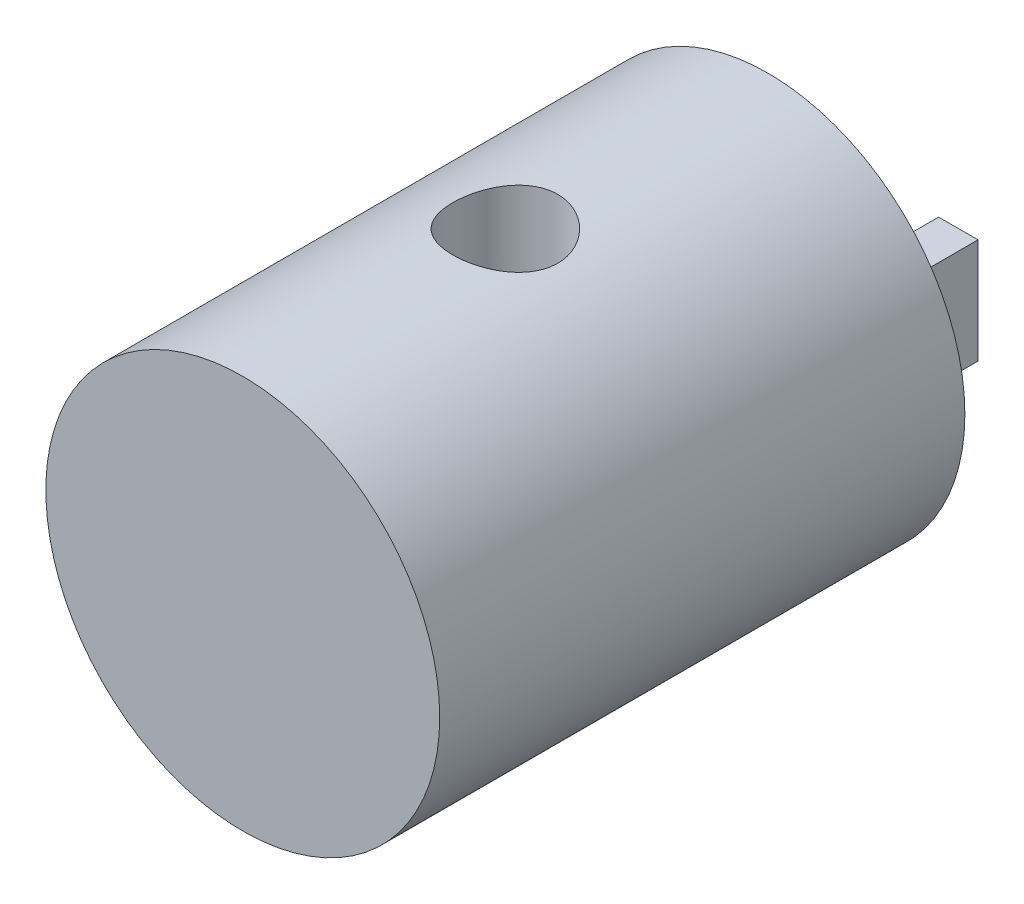
ISO-10303-21;
HEADER;
FILE_DESCRIPTION(('STEP AP214'),'2;1');
FILE_NAME('part.step','',(''),(''),'','','');
FILE_SCHEMA(('AUTOMOTIVE_DESIGN { 1 0 10303 214 1 1 1 1 }'));
ENDSEC;
DATA;
#1=APPLICATION_CONTEXT('core data for automotive mechanical design processes');
#2=APPLICATION_PROTOCOL_DEFINITION('international standard','automotive_design',2000,#1);
#3=PRODUCT_CONTEXT('',#1,'mechanical');
#4=PRODUCT('Part','Part','',(#3));
#5=PRODUCT_RELATED_PRODUCT_CATEGORY('part','',(#4));
#6=PRODUCT_DEFINITION_FORMATION('','',#4);
#7=PRODUCT_DEFINITION_CONTEXT('part definition',#1,'design');
#8=PRODUCT_DEFINITION('design','',#6,#7);
#9=PRODUCT_DEFINITION_SHAPE('','',#8);
#10=(LENGTH_UNIT() NAMED_UNIT(*) SI_UNIT(.MILLI.,.METRE.));
#11=(NAMED_UNIT(*) PLANE_ANGLE_UNIT() SI_UNIT($,.RADIAN.));
#12=(NAMED_UNIT(*) SI_UNIT($,.STERADIAN.) SOLID_ANGLE_UNIT());
#13=UNCERTAINTY_MEASURE_WITH_UNIT(LENGTH_MEASURE(1.E-05),#10,'distance_accuracy_value','');
#14=(GEOMETRIC_REPRESENTATION_CONTEXT(3) GLOBAL_UNCERTAINTY_ASSIGNED_CONTEXT((#13)) GLOBAL_UNIT_ASSIGNED_CONTEXT((#10,
#11,#12)) REPRESENTATION_CONTEXT('',''));
#15=CARTESIAN_POINT('',(0.,0.,0.));
#16=DIRECTION('',(0.,0.,1.));
#17=DIRECTION('',(1.,0.,0.));
#18=AXIS2_PLACEMENT_3D('',#15,#16,#17);
#19=CARTESIAN_POINT('',(0.,0.,20.));
#20=DIRECTION('',(0.,0.,-1.));
#21=DIRECTION('',(-1.,0.,0.));
#22=AXIS2_PLACEMENT_3D('',#19,#20,#21);
#23=CYLINDRICAL_SURFACE('',#22,7.5);
#24=CARTESIAN_POINT('',(0.,0.,20.));
#25=DIRECTION('',(0.,0.,1.));
#26=DIRECTION('',(1.,0.,0.));
#27=AXIS2_PLACEMENT_3D('',#24,#25,#26);
#28=CIRCLE('',#27,7.5);
#29=CARTESIAN_POINT('',(7.5,0.,20.));
#30=VERTEX_POINT('',#29);
#31=EDGE_CURVE('E11',#30,#30,#28,.T.);
#32=ORIENTED_EDGE('',*,*,#31,.F.);
#33=EDGE_LOOP('',(#32));
#34=FACE_BOUND('',#33,.T.);
#35=CARTESIAN_POINT('',(0.,0.,0.));
#36=DIRECTION('',(0.,0.,1.));
#37=DIRECTION('',(1.,0.,0.));
#38=AXIS2_PLACEMENT_3D('',#35,#36,#37);
#39=CIRCLE('',#38,7.5);
#40=CARTESIAN_POINT('',(7.5,0.,0.));
#41=VERTEX_POINT('',#40);
#42=EDGE_CURVE('E45',#41,#41,#39,.T.);
#43=ORIENTED_EDGE('',*,*,#42,.T.);
#44=EDGE_LOOP('',(#43));
#45=FACE_BOUND('',#44,.T.);
#46=CARTESIAN_POINT('',(0.,-7.5,12.));
#47=CARTESIAN_POINT('',(-0.110254555832854,-7.49999833810161,11.9999973830651));
#48=CARTESIAN_POINT('',(-0.220537160221841,-7.49754486162151,11.9908523858103));
#49=CARTESIAN_POINT('',(-0.437925451354464,-7.48799573621659,11.9545787692613));
#50=CARTESIAN_POINT('',(-0.545029583319086,-7.48089785332586,11.9274414955739));
#51=CARTESIAN_POINT('',(-0.752891589045313,-7.4628433325279,11.856128333136));
#52=CARTESIAN_POINT('',(-0.853657451015285,-7.45189167130375,11.811974412334));
#53=CARTESIAN_POINT('',(-1.04635368639266,-7.42728699151678,11.7079627573334));
#54=CARTESIAN_POINT('',(-1.13828347044963,-7.4136337929518,11.6481039766407));
#55=CARTESIAN_POINT('',(-1.31282950374002,-7.38474614901995,11.5129164835866));
#56=CARTESIAN_POINT('',(-1.39521168986279,-7.36948467678681,11.4372913319917));
#57=CARTESIAN_POINT('',(-1.54628713660638,-7.33927409679591,11.2733515169366));
#58=CARTESIAN_POINT('',(-1.61497863495664,-7.32432502947243,11.1850352223825));
#59=CARTESIAN_POINT('',(-1.73786409243415,-7.29615537464372,10.9963517651746));
#60=CARTESIAN_POINT('',(-1.79178877736487,-7.28296888563239,10.8958036717383));
#61=CARTESIAN_POINT('',(-1.88187548076994,-7.26021477318187,10.6866598889076));
#62=CARTESIAN_POINT('',(-1.91804077451369,-7.25064648253265,10.5780656876686));
#63=CARTESIAN_POINT('',(-1.97076920226504,-7.23649115802399,10.358504462175));
#64=CARTESIAN_POINT('',(-1.98775670244692,-7.2317964781149,10.2476464600693));
#65=CARTESIAN_POINT('',(-2.0029703470582,-7.2275983091637,10.0245623166935));
#66=CARTESIAN_POINT('',(-2.00119999705754,-7.22809385014446,9.91233643497593));
#67=CARTESIAN_POINT('',(-1.97928510002699,-7.2341237880203,9.69301458462594));
#68=CARTESIAN_POINT('',(-1.95965406064765,-7.23951735511531,9.58586281796151));
#69=CARTESIAN_POINT('',(-1.90339748722183,-7.25451013080688,9.37643166554376));
#70=CARTESIAN_POINT('',(-1.86677059492995,-7.26410967552612,9.27415266992465));
#71=CARTESIAN_POINT('',(-1.77714356965256,-7.28655661748386,9.07603185619142));
#72=CARTESIAN_POINT('',(-1.72396341137784,-7.29943942818703,8.98027566071374));
#73=CARTESIAN_POINT('',(-1.60286503823778,-7.32698229642445,8.79886584114848));
#74=CARTESIAN_POINT('',(-1.53494392224251,-7.34164270355186,8.71321421084353));
#75=CARTESIAN_POINT('',(-1.38366607263419,-7.37167510629863,8.5515110025452));
#76=CARTESIAN_POINT('',(-1.29987812728299,-7.38705471488831,8.47586368168505));
#77=CARTESIAN_POINT('',(-1.12061766820637,-7.41636381276316,8.33961121964971));
#78=CARTESIAN_POINT('',(-1.02514469420509,-7.43029324488555,8.27900667129757));
#79=CARTESIAN_POINT('',(-0.824598255497451,-7.45521820398293,8.17438209717535));
#80=CARTESIAN_POINT('',(-0.719484902551789,-7.4662007283356,8.13043522955141));
#81=CARTESIAN_POINT('',(-0.503002294390395,-7.48390044400999,8.06095281118663));
#82=CARTESIAN_POINT('',(-0.391634411928323,-7.49061856733749,8.03541323727604));
#83=CARTESIAN_POINT('',(-0.169254083145515,-7.49889158558384,8.00410512308217));
#84=CARTESIAN_POINT('',(-0.0583242376413798,-7.50058997470959,7.99778696014913));
#85=CARTESIAN_POINT('',(0.163010045901199,-7.49904471691695,8.00358316424694));
#86=CARTESIAN_POINT('',(0.273414537062114,-7.49580158080353,8.01569562610577));
#87=CARTESIAN_POINT('',(0.48860244990178,-7.48483035496021,8.05755844745998));
#88=CARTESIAN_POINT('',(0.593449852027782,-7.47718026546329,8.08700224619776));
#89=CARTESIAN_POINT('',(0.796706971176064,-7.45826294894139,8.16233594450795));
#90=CARTESIAN_POINT('',(0.895115989216027,-7.44699532996161,8.20822762625055));
#91=CARTESIAN_POINT('',(1.08483847466795,-7.42175660559528,8.31617388718054));
#92=CARTESIAN_POINT('',(1.17597518846118,-7.40773686604957,8.37852746679774));
#93=CARTESIAN_POINT('',(1.34668463539715,-7.37861452365563,8.51725163015799));
#94=CARTESIAN_POINT('',(1.42625507879918,-7.3635117072752,8.59362498260106));
#95=CARTESIAN_POINT('',(1.57388924478774,-7.33339745866704,8.76078557749456));
#96=CARTESIAN_POINT('',(1.64156519249816,-7.31840061429312,8.85191856139518));
#97=CARTESIAN_POINT('',(1.76067191185118,-7.29066447182727,9.04456469609963));
#98=CARTESIAN_POINT('',(1.81210336122161,-7.27792507956316,9.14607741362231));
#99=CARTESIAN_POINT('',(1.89687411586112,-7.2562926837321,9.35609530707611));
#100=CARTESIAN_POINT('',(1.93031812253958,-7.24737748318009,9.46455581181758));
#101=CARTESIAN_POINT('',(1.97841205118791,-7.234398251268,9.68583931967476));
#102=CARTESIAN_POINT('',(1.99306677602478,-7.23033298020014,9.79866120034792));
#103=CARTESIAN_POINT('',(2.00288989653714,-7.22761744573588,10.0214947878838));
#104=CARTESIAN_POINT('',(1.99868155618109,-7.22879397743239,10.1314773202583));
#105=CARTESIAN_POINT('',(1.97234376000439,-7.23602396081087,10.34910351401));
#106=CARTESIAN_POINT('',(1.95021476535025,-7.24207728699439,10.4567472355006));
#107=CARTESIAN_POINT('',(1.88902515699699,-7.25827571073158,10.6658557521298));
#108=CARTESIAN_POINT('',(1.8500966107558,-7.26838885019644,10.7673618427322));
#109=CARTESIAN_POINT('',(1.75651554562386,-7.29156818136177,10.9624788305341));
#110=CARTESIAN_POINT('',(1.70186056024616,-7.30463483621364,11.0560884863005));
#111=CARTESIAN_POINT('',(1.57648909268817,-7.3327292144046,11.2357303594966));
#112=CARTESIAN_POINT('',(1.50534729767909,-7.3478033310169,11.3214585349762));
#113=CARTESIAN_POINT('',(1.349830535111,-7.37795503783007,11.4799624516673));
#114=CARTESIAN_POINT('',(1.26545235435875,-7.39303262798441,11.5527350386688));
#115=CARTESIAN_POINT('',(1.08367998108868,-7.42187812403968,11.6847922376469));
#116=CARTESIAN_POINT('',(0.986045961751779,-7.43561111314551,11.7437550106493));
#117=CARTESIAN_POINT('',(0.781888640416889,-7.45983810102897,11.8443374159294));
#118=CARTESIAN_POINT('',(0.675371094696297,-7.47033417683594,11.8859681756636));
#119=CARTESIAN_POINT('',(0.47437470488099,-7.48554752513467,11.9452752854155));
#120=CARTESIAN_POINT('',(0.380762016565035,-7.49092770592602,11.9657493835925));
#121=CARTESIAN_POINT('',(0.191439795317076,-7.49815449036456,11.9931122061671));
#122=CARTESIAN_POINT('',(0.09573047040486,-7.5000014429727,12.0000022722));
#123=CARTESIAN_POINT('',(0.,-7.5,12.));
#124=B_SPLINE_CURVE_WITH_KNOTS('',3,(#46,#47,#48,#49,#50,#51,#52,#53,#54,#55,#56,#57,#58,#59,
#60,#61,#62,#63,#64,#65,#66,#67,#68,#69,#70,#71,#72,#73,#74,#75,#76,#77,#78,#79,#80,#81,#82,#83,
#84,#85,#86,#87,#88,#89,#90,#91,#92,#93,#94,#95,#96,#97,#98,#99,#100,#101,#102,#103,#104,#105,
#106,#107,#108,#109,#110,#111,#112,#113,#114,#115,#116,#117,#118,#119,#120,#121,#122,#123),
.UNSPECIFIED.,.T.,.F.,(4,2,2,2,2,2,2,2,2,2,2,2,2,2,2,2,2,2,2,2,2,2,2,2,2,2,2,2,2,2,2,2,2,2,2,2,
2,2,4),(0.,0.330412598949569,0.66098424376145,0.991130552971933,1.32129886708675,
1.65834897954967,1.99544244925149,2.33832582523229,2.68114594129699,3.01622158250468,
3.3512346040432,3.67691002045997,4.0026114681294,4.33198673346498,4.6614268811763,
5.00161259812322,5.34181171937597,5.68348809603041,6.02508977190139,6.35682717524547,
6.68853028925351,7.01453535642116,7.34057575775614,7.6730028600455,8.00549568258887,
8.34736496382789,8.68921998024107,9.02906297699387,9.36881908663983,9.69743342403611,
10.0260393052059,10.352107654483,10.67822717123,11.0139433957139,11.3497412433245,
11.692722522809,12.0354832614518,12.3223981899334,12.6092847796638),.UNSPECIFIED.);
#125=CARTESIAN_POINT('',(0.,-7.5,12.));
#126=VERTEX_POINT('',#125);
#127=EDGE_CURVE('E235',#126,#126,#124,.T.);
#128=ORIENTED_EDGE('',*,*,#127,.F.);
#129=EDGE_LOOP('',(#128));
#130=FACE_BOUND('',#129,.T.);
#131=CARTESIAN_POINT('',(0.,7.5,8.));
#132=CARTESIAN_POINT('',(0.110254555832854,7.49999833810161,8.00000261693485));
#133=CARTESIAN_POINT('',(0.22053716022184,7.49754486162151,8.00914761418967));
#134=CARTESIAN_POINT('',(0.437925451354463,7.48799573621659,8.0454212307387));
#135=CARTESIAN_POINT('',(0.545029583319086,7.48089785332586,8.07255850442612));
#136=CARTESIAN_POINT('',(0.752891589045312,7.4628433325279,8.14387166686403));
#137=CARTESIAN_POINT('',(0.853657451015285,7.45189167130375,8.18802558766602));
#138=CARTESIAN_POINT('',(1.04635368639266,7.42728699151678,8.29203724266662));
#139=CARTESIAN_POINT('',(1.13828347044963,7.4136337929518,8.35189602335929));
#140=CARTESIAN_POINT('',(1.31282950374002,7.38474614901995,8.48708351641337));
#141=CARTESIAN_POINT('',(1.39521168986279,7.36948467678681,8.56270866800827));
#142=CARTESIAN_POINT('',(1.54628713660638,7.33927409679591,8.72664848306336));
#143=CARTESIAN_POINT('',(1.61497863495664,7.32432502947243,8.81496477761753));
#144=CARTESIAN_POINT('',(1.73786409243415,7.29615537464372,9.00364823482545));
#145=CARTESIAN_POINT('',(1.79178877736487,7.28296888563239,9.10419632826173));
#146=CARTESIAN_POINT('',(1.88187548076994,7.26021477318187,9.31334011109242));
#147=CARTESIAN_POINT('',(1.91804077451369,7.25064648253265,9.42193431233144));
#148=CARTESIAN_POINT('',(1.97076920226504,7.23649115802399,9.64149553782501));
#149=CARTESIAN_POINT('',(1.98775670244692,7.2317964781149,9.75235353993074));
#150=CARTESIAN_POINT('',(2.0029703470582,7.2275983091637,9.97543768330654));
#151=CARTESIAN_POINT('',(2.00119999705754,7.22809385014446,10.0876635650241));
#152=CARTESIAN_POINT('',(1.97928510002699,7.2341237880203,10.3069854153741));
#153=CARTESIAN_POINT('',(1.95965406064765,7.23951735511531,10.4141371820385));
#154=CARTESIAN_POINT('',(1.90339748722183,7.25451013080688,10.6235683344562));
#155=CARTESIAN_POINT('',(1.86677059492995,7.26410967552612,10.7258473300753));
#156=CARTESIAN_POINT('',(1.77714356965256,7.28655661748386,10.9239681438086));
#157=CARTESIAN_POINT('',(1.72396341137784,7.29943942818703,11.0197243392863));
#158=CARTESIAN_POINT('',(1.60286503823778,7.32698229642445,11.2011341588515));
#159=CARTESIAN_POINT('',(1.53494392224251,7.34164270355186,11.2867857891565));
#160=CARTESIAN_POINT('',(1.38366607263419,7.37167510629863,11.4484889974548));
#161=CARTESIAN_POINT('',(1.29987812728299,7.38705471488831,11.524136318315));
#162=CARTESIAN_POINT('',(1.12061766820637,7.41636381276316,11.6603887803503));
#163=CARTESIAN_POINT('',(1.02514469420509,7.43029324488555,11.7209933287024));
#164=CARTESIAN_POINT('',(0.824598255497451,7.45521820398293,11.8256179028246));
#165=CARTESIAN_POINT('',(0.719484902551788,7.4662007283356,11.8695647704486));
#166=CARTESIAN_POINT('',(0.503002294390395,7.48390044400999,11.9390471888134));
#167=CARTESIAN_POINT('',(0.391634411928323,7.49061856733749,11.964586762724));
#168=CARTESIAN_POINT('',(0.169254083145515,7.49889158558384,11.9958948769178));
#169=CARTESIAN_POINT('',(0.0583242376413798,7.50058997470959,12.0022130398509));
#170=CARTESIAN_POINT('',(-0.163010045901199,7.49904471691695,11.9964168357531));
#171=CARTESIAN_POINT('',(-0.273414537062114,7.49580158080353,11.9843043738942));
#172=CARTESIAN_POINT('',(-0.488602449901779,7.48483035496021,11.94244155254));
#173=CARTESIAN_POINT('',(-0.593449852027782,7.47718026546329,11.9129977538022));
#174=CARTESIAN_POINT('',(-0.796706971176064,7.45826294894139,11.8376640554921));
#175=CARTESIAN_POINT('',(-0.895115989216027,7.44699532996161,11.7917723737495));
#176=CARTESIAN_POINT('',(-1.08483847466795,7.42175660559528,11.6838261128195));
#177=CARTESIAN_POINT('',(-1.17597518846118,7.40773686604957,11.6214725332023));
#178=CARTESIAN_POINT('',(-1.34668463539715,7.37861452365563,11.482748369842));
#179=CARTESIAN_POINT('',(-1.42625507879918,7.3635117072752,11.4063750173989));
#180=CARTESIAN_POINT('',(-1.57388924478774,7.33339745866704,11.2392144225054));
#181=CARTESIAN_POINT('',(-1.64156519249816,7.31840061429312,11.1480814386048));
#182=CARTESIAN_POINT('',(-1.76067191185118,7.29066447182727,10.9554353039004));
#183=CARTESIAN_POINT('',(-1.81210336122161,7.27792507956316,10.8539225863777));
#184=CARTESIAN_POINT('',(-1.89687411586112,7.2562926837321,10.6439046929239));
#185=CARTESIAN_POINT('',(-1.93031812253958,7.24737748318009,10.5354441881824));
#186=CARTESIAN_POINT('',(-1.97841205118791,7.234398251268,10.3141606803252));
#187=CARTESIAN_POINT('',(-1.99306677602478,7.23033298020014,10.2013387996521));
#188=CARTESIAN_POINT('',(-2.00288989653714,7.22761744573588,9.9785052121162));
#189=CARTESIAN_POINT('',(-1.99868155618109,7.22879397743239,9.86852267974172));
#190=CARTESIAN_POINT('',(-1.97234376000439,7.23602396081087,9.65089648598997));
#191=CARTESIAN_POINT('',(-1.95021476535025,7.24207728699439,9.54325276449942));
#192=CARTESIAN_POINT('',(-1.88902515699699,7.25827571073158,9.33414424787015));
#193=CARTESIAN_POINT('',(-1.8500966107558,7.26838885019644,9.23263815726781));
#194=CARTESIAN_POINT('',(-1.75651554562386,7.29156818136177,9.03752116946586));
#195=CARTESIAN_POINT('',(-1.70186056024616,7.30463483621364,8.9439115136995));
#196=CARTESIAN_POINT('',(-1.57648909268817,7.3327292144046,8.76426964050338));
#197=CARTESIAN_POINT('',(-1.50534729767909,7.3478033310169,8.67854146502378));
#198=CARTESIAN_POINT('',(-1.349830535111,7.37795503783007,8.52003754833267));
#199=CARTESIAN_POINT('',(-1.26545235435875,7.39303262798441,8.44726496133116));
#200=CARTESIAN_POINT('',(-1.08367998108868,7.42187812403968,8.31520776235314));
#201=CARTESIAN_POINT('',(-0.986045961751779,7.43561111314551,8.25624498935067));
#202=CARTESIAN_POINT('',(-0.781888640416889,7.45983810102897,8.15566258407064));
#203=CARTESIAN_POINT('',(-0.675371094696297,7.47033417683594,8.1140318243364));
#204=CARTESIAN_POINT('',(-0.47437470488099,7.48554752513467,8.05472471458448));
#205=CARTESIAN_POINT('',(-0.380762016565035,7.49092770592602,8.0342506164075));
#206=CARTESIAN_POINT('',(-0.191439795317076,7.49815449036456,8.00688779383294));
#207=CARTESIAN_POINT('',(-0.0957304704048602,7.5000014429727,7.99999772779998));
#208=CARTESIAN_POINT('',(0.,7.5,8.));
#209=B_SPLINE_CURVE_WITH_KNOTS('',3,(#131,#132,#133,#134,#135,#136,#137,#138,#139,#140,#141,
#142,#143,#144,#145,#146,#147,#148,#149,#150,#151,#152,#153,#154,#155,#156,#157,#158,#159,#160,
#161,#162,#163,#164,#165,#166,#167,#168,#169,#170,#171,#172,#173,#174,#175,#176,#177,#178,#179,
#180,#181,#182,#183,#184,#185,#186,#187,#188,#189,#190,#191,#192,#193,#194,#195,#196,#197,#198,
#199,#200,#201,#202,#203,#204,#205,#206,#207,#208),.UNSPECIFIED.,.T.,.F.,(4,2,2,2,2,2,2,2,2,2,2,
2,2,2,2,2,2,2,2,2,2,2,2,2,2,2,2,2,2,2,2,2,2,2,2,2,2,2,4),(0.,0.330412598949569,0.66098424376145,
0.991130552971931,1.32129886708675,1.65834897954967,1.99544244925149,2.33832582523229,
2.68114594129699,3.01622158250468,3.3512346040432,3.67691002045997,4.0026114681294,
4.33198673346498,4.6614268811763,5.00161259812322,5.34181171937597,5.68348809603041,
6.02508977190139,6.35682717524547,6.68853028925351,7.01453535642116,7.34057575775614,
7.6730028600455,8.00549568258887,8.34736496382788,8.68921998024107,9.02906297699387,
9.36881908663983,9.69743342403611,10.0260393052059,10.352107654483,10.67822717123,
11.0139433957139,11.3497412433245,11.692722522809,12.0354832614518,12.3223981899334,
12.6092847796638),.UNSPECIFIED.);
#210=CARTESIAN_POINT('',(0.,7.5,8.));
#211=VERTEX_POINT('',#210);
#212=EDGE_CURVE('E227',#211,#211,#209,.T.);
#213=ORIENTED_EDGE('',*,*,#212,.T.);
#214=EDGE_LOOP('',(#213));
#215=FACE_BOUND('',#214,.T.);
#216=ADVANCED_FACE('F37',(#34,#45,#130,#215),#23,.T.);
#217=CARTESIAN_POINT('',(-4.,2.,-4.));
#218=DIRECTION('',(0.,-1.,0.));
#219=DIRECTION('',(0.,0.,-1.));
#220=AXIS2_PLACEMENT_3D('',#217,#218,#219);
#221=PLANE('',#220);
#222=DIRECTION('',(1.,0.,0.));
#223=VECTOR('',#222,1.);
#224=CARTESIAN_POINT('',(-4.,2.,-4.));
#225=LINE('',#224,#223);
#226=CARTESIAN_POINT('',(2.5,2.,-4.));
#227=VERTEX_POINT('',#226);
#228=CARTESIAN_POINT('',(4.,2.,-4.));
#229=VERTEX_POINT('',#228);
#230=EDGE_CURVE('E124',#227,#229,#225,.T.);
#231=ORIENTED_EDGE('',*,*,#230,.F.);
#232=DIRECTION('',(0.,0.,-1.));
#233=VECTOR('',#232,1.);
#234=CARTESIAN_POINT('',(2.5,2.,0.));
#235=LINE('',#234,#233);
#236=CARTESIAN_POINT('',(2.5,2.,0.));
#237=VERTEX_POINT('',#236);
#238=EDGE_CURVE('E110',#237,#227,#235,.T.);
#239=ORIENTED_EDGE('',*,*,#238,.F.);
#240=DIRECTION('',(1.,0.,0.));
#241=VECTOR('',#240,1.);
#242=CARTESIAN_POINT('',(-4.,2.,0.));
#243=LINE('',#242,#241);
#244=CARTESIAN_POINT('',(4.,2.,0.));
#245=VERTEX_POINT('',#244);
#246=EDGE_CURVE('E138',#237,#245,#243,.T.);
#247=ORIENTED_EDGE('',*,*,#246,.T.);
#248=DIRECTION('',(0.,0.,1.));
#249=VECTOR('',#248,1.);
#250=CARTESIAN_POINT('',(4.,2.,-4.));
#251=LINE('',#250,#249);
#252=EDGE_CURVE('E153',#229,#245,#251,.T.);
#253=ORIENTED_EDGE('',*,*,#252,.F.);
#254=EDGE_LOOP('',(#231,#239,#247,#253));
#255=FACE_BOUND('',#254,.T.);
#256=ADVANCED_FACE('F177',(#255),#221,.F.);
#257=CARTESIAN_POINT('',(4.,-2.,-4.));
#258=DIRECTION('',(0.,1.,0.));
#259=DIRECTION('',(0.,0.,1.));
#260=AXIS2_PLACEMENT_3D('',#257,#258,#259);
#261=PLANE('',#260);
#262=DIRECTION('',(-1.,0.,0.));
#263=VECTOR('',#262,1.);
#264=CARTESIAN_POINT('',(4.,-2.,0.));
#265=LINE('',#264,#263);
#266=CARTESIAN_POINT('',(4.,-2.,0.));
#267=VERTEX_POINT('',#266);
#268=CARTESIAN_POINT('',(2.5,-2.,0.));
#269=VERTEX_POINT('',#268);
#270=EDGE_CURVE('E142',#267,#269,#265,.T.);
#271=ORIENTED_EDGE('',*,*,#270,.T.);
#272=DIRECTION('',(0.,0.,1.));
#273=VECTOR('',#272,1.);
#274=CARTESIAN_POINT('',(2.5,-2.,0.));
#275=LINE('',#274,#273);
#276=CARTESIAN_POINT('',(2.5,-2.,-4.));
#277=VERTEX_POINT('',#276);
#278=EDGE_CURVE('E117',#277,#269,#275,.T.);
#279=ORIENTED_EDGE('',*,*,#278,.F.);
#280=DIRECTION('',(-1.,0.,0.));
#281=VECTOR('',#280,1.);
#282=CARTESIAN_POINT('',(4.,-2.,-4.));
#283=LINE('',#282,#281);
#284=CARTESIAN_POINT('',(4.,-2.,-4.));
#285=VERTEX_POINT('',#284);
#286=EDGE_CURVE('E131',#285,#277,#283,.T.);
#287=ORIENTED_EDGE('',*,*,#286,.F.);
#288=DIRECTION('',(0.,0.,1.));
#289=VECTOR('',#288,1.);
#290=CARTESIAN_POINT('',(4.,-2.,-4.));
#291=LINE('',#290,#289);
#292=EDGE_CURVE('E150',#285,#267,#291,.T.);
#293=ORIENTED_EDGE('',*,*,#292,.T.);
#294=EDGE_LOOP('',(#271,#279,#287,#293));
#295=FACE_BOUND('',#294,.T.);
#296=ADVANCED_FACE('F172',(#295),#261,.F.);
#297=CARTESIAN_POINT('',(0.,0.,-4.));
#298=DIRECTION('',(0.,0.,-1.));
#299=DIRECTION('',(-1.,0.,0.));
#300=AXIS2_PLACEMENT_3D('',#297,#298,#299);
#301=PLANE('',#300);
#302=DIRECTION('',(0.,1.,0.));
#303=VECTOR('',#302,1.);
#304=CARTESIAN_POINT('',(2.5,-7.501,-4.));
#305=LINE('',#304,#303);
#306=EDGE_CURVE('E245',#277,#227,#305,.T.);
#307=ORIENTED_EDGE('',*,*,#306,.T.);
#308=ORIENTED_EDGE('',*,*,#230,.T.);
#309=DIRECTION('',(0.,-1.,0.));
#310=VECTOR('',#309,1.);
#311=CARTESIAN_POINT('',(4.,2.,-4.));
#312=LINE('',#311,#310);
#313=EDGE_CURVE('E123',#229,#285,#312,.T.);
#314=ORIENTED_EDGE('',*,*,#313,.T.);
#315=ORIENTED_EDGE('',*,*,#286,.T.);
#316=EDGE_LOOP('',(#307,#308,#314,#315));
#317=FACE_BOUND('',#316,.T.);
#318=ADVANCED_FACE('F163',(#317),#301,.T.);
#319=CARTESIAN_POINT('',(0.,0.,0.));
#320=DIRECTION('',(0.,0.,1.));
#321=DIRECTION('',(1.,0.,0.));
#322=AXIS2_PLACEMENT_3D('',#319,#320,#321);
#323=PLANE('',#322);
#324=ORIENTED_EDGE('',*,*,#246,.F.);
#325=DIRECTION('',(0.,1.,0.));
#326=VECTOR('',#325,1.);
#327=CARTESIAN_POINT('',(2.5,-7.501,0.));
#328=LINE('',#327,#326);
#329=EDGE_CURVE('E248',#269,#237,#328,.T.);
#330=ORIENTED_EDGE('',*,*,#329,.F.);
#331=ORIENTED_EDGE('',*,*,#270,.F.);
#332=DIRECTION('',(0.,-1.,0.));
#333=VECTOR('',#332,1.);
#334=CARTESIAN_POINT('',(4.,2.,0.));
#335=LINE('',#334,#333);
#336=EDGE_CURVE('E137',#245,#267,#335,.T.);
#337=ORIENTED_EDGE('',*,*,#336,.F.);
#338=EDGE_LOOP('',(#324,#330,#331,#337));
#339=FACE_BOUND('',#338,.T.);
#340=ORIENTED_EDGE('',*,*,#42,.F.);
#341=EDGE_LOOP('',(#340));
#342=FACE_BOUND('',#341,.T.);
#343=CARTESIAN_POINT('',(-4.,2.,0.));
#344=VERTEX_POINT('',#343);
#345=CARTESIAN_POINT('',(-2.5,2.,0.));
#346=VERTEX_POINT('',#345);
#347=EDGE_CURVE('E61',#344,#346,#243,.T.);
#348=ORIENTED_EDGE('',*,*,#347,.F.);
#349=DIRECTION('',(0.,1.,0.));
#350=VECTOR('',#349,1.);
#351=CARTESIAN_POINT('',(-4.,-2.,0.));
#352=LINE('',#351,#350);
#353=CARTESIAN_POINT('',(-4.,-2.,0.));
#354=VERTEX_POINT('',#353);
#355=EDGE_CURVE('E128',#354,#344,#352,.T.);
#356=ORIENTED_EDGE('',*,*,#355,.F.);
#357=CARTESIAN_POINT('',(-2.5,-2.,0.));
#358=VERTEX_POINT('',#357);
#359=EDGE_CURVE('E141',#358,#354,#265,.T.);
#360=ORIENTED_EDGE('',*,*,#359,.F.);
#361=DIRECTION('',(0.,1.,0.));
#362=VECTOR('',#361,1.);
#363=CARTESIAN_POINT('',(-2.5,-7.501,0.));
#364=LINE('',#363,#362);
#365=EDGE_CURVE('E109',#358,#346,#364,.T.);
#366=ORIENTED_EDGE('',*,*,#365,.T.);
#367=EDGE_LOOP('',(#348,#356,#360,#366));
#368=FACE_BOUND('',#367,.T.);
#369=ADVANCED_FACE('F160',(#339,#342,#368),#323,.F.);
#370=CARTESIAN_POINT('',(0.,0.,20.));
#371=DIRECTION('',(0.,0.,1.));
#372=DIRECTION('',(1.,0.,0.));
#373=AXIS2_PLACEMENT_3D('',#370,#371,#372);
#374=PLANE('',#373);
#375=ORIENTED_EDGE('',*,*,#31,.T.);
#376=EDGE_LOOP('',(#375));
#377=FACE_BOUND('',#376,.T.);
#378=ADVANCED_FACE('F162',(#377),#374,.T.);
#379=ORIENTED_EDGE('',*,*,#347,.T.);
#380=DIRECTION('',(0.,0.,1.));
#381=VECTOR('',#380,1.);
#382=CARTESIAN_POINT('',(-2.5,2.,-4.));
#383=LINE('',#382,#381);
#384=CARTESIAN_POINT('',(-2.5,2.,-4.));
#385=VERTEX_POINT('',#384);
#386=EDGE_CURVE('E105',#385,#346,#383,.T.);
#387=ORIENTED_EDGE('',*,*,#386,.F.);
#388=CARTESIAN_POINT('',(-4.,2.,-4.));
#389=VERTEX_POINT('',#388);
#390=EDGE_CURVE('E116',#389,#385,#225,.T.);
#391=ORIENTED_EDGE('',*,*,#390,.F.);
#392=DIRECTION('',(0.,0.,1.));
#393=VECTOR('',#392,1.);
#394=CARTESIAN_POINT('',(-4.,2.,-4.));
#395=LINE('',#394,#393);
#396=EDGE_CURVE('E135',#389,#344,#395,.T.);
#397=ORIENTED_EDGE('',*,*,#396,.T.);
#398=EDGE_LOOP('',(#379,#387,#391,#397));
#399=FACE_BOUND('',#398,.T.);
#400=ADVANCED_FACE('F114',(#399),#221,.F.);
#401=CARTESIAN_POINT('',(4.,2.,-4.));
#402=DIRECTION('',(-1.,0.,0.));
#403=DIRECTION('',(0.,0.,1.));
#404=AXIS2_PLACEMENT_3D('',#401,#402,#403);
#405=PLANE('',#404);
#406=ORIENTED_EDGE('',*,*,#336,.T.);
#407=ORIENTED_EDGE('',*,*,#292,.F.);
#408=ORIENTED_EDGE('',*,*,#313,.F.);
#409=ORIENTED_EDGE('',*,*,#252,.T.);
#410=EDGE_LOOP('',(#406,#407,#408,#409));
#411=FACE_BOUND('',#410,.T.);
#412=ADVANCED_FACE('F196',(#411),#405,.F.);
#413=CARTESIAN_POINT('',(-2.5,-2.,-4.));
#414=VERTEX_POINT('',#413);
#415=CARTESIAN_POINT('',(-4.,-2.,-4.));
#416=VERTEX_POINT('',#415);
#417=EDGE_CURVE('E126',#414,#416,#283,.T.);
#418=ORIENTED_EDGE('',*,*,#417,.F.);
#419=DIRECTION('',(0.,0.,-1.));
#420=VECTOR('',#419,1.);
#421=CARTESIAN_POINT('',(-2.5,-2.,-4.));
#422=LINE('',#421,#420);
#423=EDGE_CURVE('E53',#358,#414,#422,.T.);
#424=ORIENTED_EDGE('',*,*,#423,.F.);
#425=ORIENTED_EDGE('',*,*,#359,.T.);
#426=DIRECTION('',(0.,0.,1.));
#427=VECTOR('',#426,1.);
#428=CARTESIAN_POINT('',(-4.,-2.,-4.));
#429=LINE('',#428,#427);
#430=EDGE_CURVE('E147',#416,#354,#429,.T.);
#431=ORIENTED_EDGE('',*,*,#430,.F.);
#432=EDGE_LOOP('',(#418,#424,#425,#431));
#433=FACE_BOUND('',#432,.T.);
#434=ADVANCED_FACE('F193',(#433),#261,.F.);
#435=CARTESIAN_POINT('',(-4.,-2.,-4.));
#436=DIRECTION('',(1.,0.,0.));
#437=DIRECTION('',(0.,0.,-1.));
#438=AXIS2_PLACEMENT_3D('',#435,#436,#437);
#439=PLANE('',#438);
#440=CARTESIAN_POINT('',(-4.,0.,-2.5));
#441=DIRECTION('',(-1.,0.,0.));
#442=DIRECTION('',(0.,0.,1.));
#443=AXIS2_PLACEMENT_3D('',#440,#441,#442);
#444=CIRCLE('',#443,1.);
#445=CARTESIAN_POINT('',(-4.,0.,-1.5));
#446=VERTEX_POINT('',#445);
#447=EDGE_CURVE('E234',#446,#446,#444,.T.);
#448=ORIENTED_EDGE('',*,*,#447,.F.);
#449=EDGE_LOOP('',(#448));
#450=FACE_BOUND('',#449,.T.);
#451=ORIENTED_EDGE('',*,*,#355,.T.);
#452=ORIENTED_EDGE('',*,*,#396,.F.);
#453=DIRECTION('',(0.,1.,0.));
#454=VECTOR('',#453,1.);
#455=CARTESIAN_POINT('',(-4.,-2.,-4.));
#456=LINE('',#455,#454);
#457=EDGE_CURVE('E121',#416,#389,#456,.T.);
#458=ORIENTED_EDGE('',*,*,#457,.F.);
#459=ORIENTED_EDGE('',*,*,#430,.T.);
#460=EDGE_LOOP('',(#451,#452,#458,#459));
#461=FACE_BOUND('',#460,.T.);
#462=ADVANCED_FACE('F203',(#450,#461),#439,.F.);
#463=DIRECTION('',(0.,1.,0.));
#464=VECTOR('',#463,1.);
#465=CARTESIAN_POINT('',(-2.5,-7.501,-4.));
#466=LINE('',#465,#464);
#467=EDGE_CURVE('E102',#414,#385,#466,.T.);
#468=ORIENTED_EDGE('',*,*,#467,.F.);
#469=ORIENTED_EDGE('',*,*,#417,.T.);
#470=ORIENTED_EDGE('',*,*,#457,.T.);
#471=ORIENTED_EDGE('',*,*,#390,.T.);
#472=EDGE_LOOP('',(#468,#469,#470,#471));
#473=FACE_BOUND('',#472,.T.);
#474=ADVANCED_FACE('F119',(#473),#301,.T.);
#475=CARTESIAN_POINT('',(2.5,-7.501,0.));
#476=DIRECTION('',(1.,0.,0.));
#477=DIRECTION('',(0.,0.,-1.));
#478=AXIS2_PLACEMENT_3D('',#475,#476,#477);
#479=PLANE('',#478);
#480=ORIENTED_EDGE('',*,*,#278,.T.);
#481=ORIENTED_EDGE('',*,*,#329,.T.);
#482=ORIENTED_EDGE('',*,*,#238,.T.);
#483=ORIENTED_EDGE('',*,*,#306,.F.);
#484=EDGE_LOOP('',(#480,#481,#482,#483));
#485=FACE_BOUND('',#484,.T.);
#486=ADVANCED_FACE('F210',(#485),#479,.F.);
#487=CARTESIAN_POINT('',(-2.5,-7.501,-4.));
#488=DIRECTION('',(-1.,0.,0.));
#489=DIRECTION('',(0.,0.,1.));
#490=AXIS2_PLACEMENT_3D('',#487,#488,#489);
#491=PLANE('',#490);
#492=CARTESIAN_POINT('',(-2.5,0.,-2.5));
#493=DIRECTION('',(-1.,0.,0.));
#494=DIRECTION('',(0.,0.,1.));
#495=AXIS2_PLACEMENT_3D('',#492,#493,#494);
#496=CIRCLE('',#495,1.);
#497=CARTESIAN_POINT('',(-2.5,0.,-1.5));
#498=VERTEX_POINT('',#497);
#499=EDGE_CURVE('E40',#498,#498,#496,.T.);
#500=ORIENTED_EDGE('',*,*,#499,.T.);
#501=EDGE_LOOP('',(#500));
#502=FACE_BOUND('',#501,.T.);
#503=ORIENTED_EDGE('',*,*,#423,.T.);
#504=ORIENTED_EDGE('',*,*,#467,.T.);
#505=ORIENTED_EDGE('',*,*,#386,.T.);
#506=ORIENTED_EDGE('',*,*,#365,.F.);
#507=EDGE_LOOP('',(#503,#504,#505,#506));
#508=FACE_BOUND('',#507,.T.);
#509=ADVANCED_FACE('F104',(#502,#508),#491,.F.);
#510=CARTESIAN_POINT('',(1.,0.,-2.5));
#511=DIRECTION('',(-1.,0.,0.));
#512=DIRECTION('',(0.,0.,1.));
#513=AXIS2_PLACEMENT_3D('',#510,#511,#512);
#514=CYLINDRICAL_SURFACE('',#513,1.);
#515=ORIENTED_EDGE('',*,*,#447,.T.);
#516=EDGE_LOOP('',(#515));
#517=FACE_BOUND('',#516,.T.);
#518=ORIENTED_EDGE('',*,*,#499,.F.);
#519=EDGE_LOOP('',(#518));
#520=FACE_BOUND('',#519,.T.);
#521=ADVANCED_FACE('F213',(#517,#520),#514,.F.);
#522=CARTESIAN_POINT('',(0.,7.501,10.));
#523=DIRECTION('',(0.,-1.,0.));
#524=DIRECTION('',(0.,0.,-1.));
#525=AXIS2_PLACEMENT_3D('',#522,#523,#524);
#526=CYLINDRICAL_SURFACE('',#525,2.);
#527=ORIENTED_EDGE('',*,*,#212,.F.);
#528=EDGE_LOOP('',(#527));
#529=FACE_BOUND('',#528,.T.);
#530=ORIENTED_EDGE('',*,*,#127,.T.);
#531=EDGE_LOOP('',(#530));
#532=FACE_BOUND('',#531,.T.);
#533=ADVANCED_FACE('F219',(#529,#532),#526,.F.);
#534=CLOSED_SHELL('',(#216,#256,#296,#318,#369,#378,#400,#412,#434,#462,#474,#486,#509,#521,#533));
#535=MANIFOLD_SOLID_BREP('B2',#534);
#536=ADVANCED_BREP_SHAPE_REPRESENTATION('',(#18,#535),#14);
#537=SHAPE_DEFINITION_REPRESENTATION(#9,#536);
ENDSEC;
END-ISO-10303-21;
